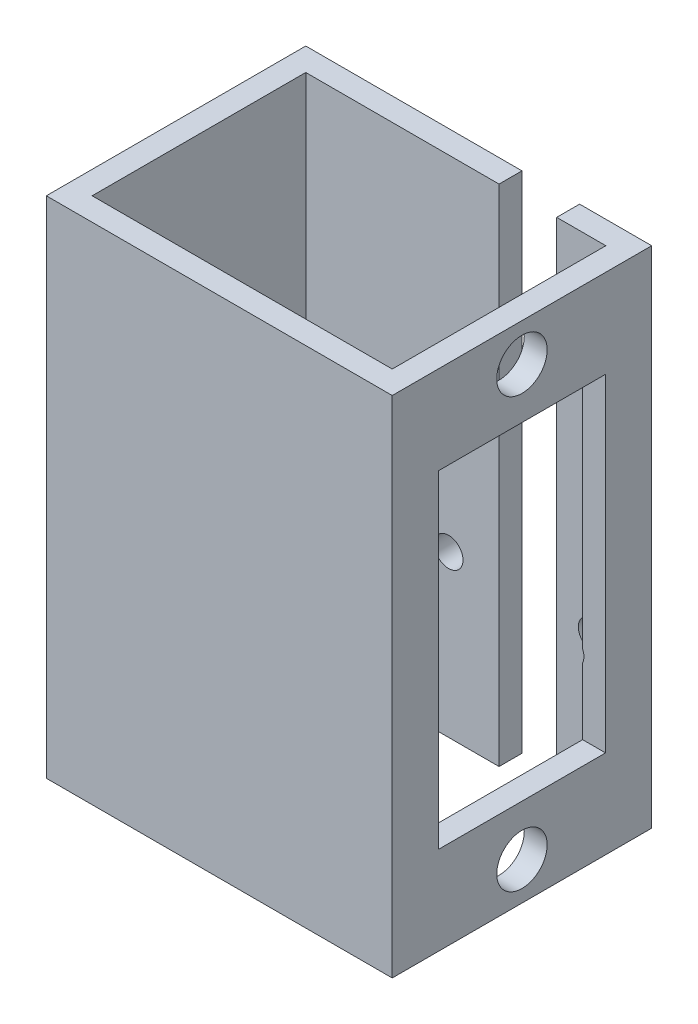
ISO-10303-21;
HEADER;
FILE_DESCRIPTION(('STEP AP214'),'2;1');
FILE_NAME('part.step','',(''),(''),'','','');
FILE_SCHEMA(('AUTOMOTIVE_DESIGN { 1 0 10303 214 1 1 1 1 }'));
ENDSEC;
DATA;
#1=APPLICATION_CONTEXT('core data for automotive mechanical design processes');
#2=APPLICATION_PROTOCOL_DEFINITION('international standard','automotive_design',2000,#1);
#3=PRODUCT_CONTEXT('',#1,'mechanical');
#4=PRODUCT('Part','Part','',(#3));
#5=PRODUCT_RELATED_PRODUCT_CATEGORY('part','',(#4));
#6=PRODUCT_DEFINITION_FORMATION('','',#4);
#7=PRODUCT_DEFINITION_CONTEXT('part definition',#1,'design');
#8=PRODUCT_DEFINITION('design','',#6,#7);
#9=PRODUCT_DEFINITION_SHAPE('','',#8);
#10=(LENGTH_UNIT() NAMED_UNIT(*) SI_UNIT(.MILLI.,.METRE.));
#11=(NAMED_UNIT(*) PLANE_ANGLE_UNIT() SI_UNIT($,.RADIAN.));
#12=(NAMED_UNIT(*) SI_UNIT($,.STERADIAN.) SOLID_ANGLE_UNIT());
#13=UNCERTAINTY_MEASURE_WITH_UNIT(LENGTH_MEASURE(1.E-05),#10,'distance_accuracy_value','');
#14=(GEOMETRIC_REPRESENTATION_CONTEXT(3) GLOBAL_UNCERTAINTY_ASSIGNED_CONTEXT((#13)) GLOBAL_UNIT_ASSIGNED_CONTEXT((#10,
#11,#12)) REPRESENTATION_CONTEXT('',''));
#15=CARTESIAN_POINT('',(0.,0.,0.));
#16=DIRECTION('',(0.,0.,1.));
#17=DIRECTION('',(1.,0.,0.));
#18=AXIS2_PLACEMENT_3D('',#15,#16,#17);
#19=CARTESIAN_POINT('',(0.,35.,0.));
#20=DIRECTION('',(1.,0.,0.));
#21=DIRECTION('',(0.,0.,-1.));
#22=AXIS2_PLACEMENT_3D('',#19,#20,#21);
#23=PLANE('',#22);
#24=CARTESIAN_POINT('',(0.,11.15,9.));
#25=DIRECTION('',(-1.,0.,0.));
#26=DIRECTION('',(0.,0.,1.));
#27=AXIS2_PLACEMENT_3D('',#24,#25,#26);
#28=CIRCLE('',#27,1.25);
#29=CARTESIAN_POINT('',(0.,11.15,10.25));
#30=VERTEX_POINT('',#29);
#31=EDGE_CURVE('E190',#30,#30,#28,.T.);
#32=ORIENTED_EDGE('',*,*,#31,.F.);
#33=EDGE_LOOP('',(#32));
#34=FACE_BOUND('',#33,.T.);
#35=DIRECTION('',(0.,0.,1.));
#36=VECTOR('',#35,1.);
#37=CARTESIAN_POINT('',(0.,0.,0.));
#38=LINE('',#37,#36);
#39=CARTESIAN_POINT('',(0.,0.,0.));
#40=VERTEX_POINT('',#39);
#41=CARTESIAN_POINT('',(0.,0.,18.));
#42=VERTEX_POINT('',#41);
#43=EDGE_CURVE('E219',#40,#42,#38,.T.);
#44=ORIENTED_EDGE('',*,*,#43,.T.);
#45=DIRECTION('',(0.,-1.,0.));
#46=VECTOR('',#45,1.);
#47=CARTESIAN_POINT('',(0.,35.,18.));
#48=LINE('',#47,#46);
#49=CARTESIAN_POINT('',(0.,35.,18.));
#50=VERTEX_POINT('',#49);
#51=EDGE_CURVE('E307',#50,#42,#48,.T.);
#52=ORIENTED_EDGE('',*,*,#51,.F.);
#53=DIRECTION('',(0.,0.,1.));
#54=VECTOR('',#53,1.);
#55=CARTESIAN_POINT('',(0.,35.,0.));
#56=LINE('',#55,#54);
#57=CARTESIAN_POINT('',(0.,35.,0.));
#58=VERTEX_POINT('',#57);
#59=EDGE_CURVE('E225',#58,#50,#56,.T.);
#60=ORIENTED_EDGE('',*,*,#59,.F.);
#61=DIRECTION('',(0.,-1.,0.));
#62=VECTOR('',#61,1.);
#63=CARTESIAN_POINT('',(0.,35.,0.));
#64=LINE('',#63,#62);
#65=EDGE_CURVE('E251',#58,#40,#64,.T.);
#66=ORIENTED_EDGE('',*,*,#65,.T.);
#67=EDGE_LOOP('',(#44,#52,#60,#66));
#68=FACE_BOUND('',#67,.T.);
#69=ADVANCED_FACE('F34',(#34,#68),#23,.F.);
#70=CARTESIAN_POINT('',(0.,35.,18.));
#71=DIRECTION('',(0.,0.,-1.));
#72=DIRECTION('',(-1.,0.,0.));
#73=AXIS2_PLACEMENT_3D('',#70,#71,#72);
#74=PLANE('',#73);
#75=DIRECTION('',(1.,0.,0.));
#76=VECTOR('',#75,1.);
#77=CARTESIAN_POINT('',(0.,0.,18.));
#78=LINE('',#77,#76);
#79=CARTESIAN_POINT('',(24.,0.,18.));
#80=VERTEX_POINT('',#79);
#81=EDGE_CURVE('E254',#42,#80,#78,.T.);
#82=ORIENTED_EDGE('',*,*,#81,.T.);
#83=DIRECTION('',(0.,-1.,0.));
#84=VECTOR('',#83,1.);
#85=CARTESIAN_POINT('',(24.,35.,18.));
#86=LINE('',#85,#84);
#87=CARTESIAN_POINT('',(24.,35.,18.));
#88=VERTEX_POINT('',#87);
#89=EDGE_CURVE('E304',#88,#80,#86,.T.);
#90=ORIENTED_EDGE('',*,*,#89,.F.);
#91=DIRECTION('',(1.,0.,0.));
#92=VECTOR('',#91,1.);
#93=CARTESIAN_POINT('',(0.,35.,18.));
#94=LINE('',#93,#92);
#95=EDGE_CURVE('E228',#50,#88,#94,.T.);
#96=ORIENTED_EDGE('',*,*,#95,.F.);
#97=ORIENTED_EDGE('',*,*,#51,.T.);
#98=EDGE_LOOP('',(#82,#90,#96,#97));
#99=FACE_BOUND('',#98,.T.);
#100=ADVANCED_FACE('F360',(#99),#74,.F.);
#101=CARTESIAN_POINT('',(24.,35.,0.));
#102=DIRECTION('',(-1.,0.,0.));
#103=DIRECTION('',(0.,0.,1.));
#104=AXIS2_PLACEMENT_3D('',#101,#102,#103);
#105=PLANE('',#104);
#106=CARTESIAN_POINT('',(24.,32.375,9.));
#107=DIRECTION('',(1.,0.,0.));
#108=DIRECTION('',(0.,0.,-1.));
#109=AXIS2_PLACEMENT_3D('',#106,#107,#108);
#110=CIRCLE('',#109,1.75);
#111=CARTESIAN_POINT('',(24.,32.375,7.25));
#112=VERTEX_POINT('',#111);
#113=EDGE_CURVE('E185',#112,#112,#110,.T.);
#114=ORIENTED_EDGE('',*,*,#113,.F.);
#115=EDGE_LOOP('',(#114));
#116=FACE_BOUND('',#115,.T.);
#117=CARTESIAN_POINT('',(24.,2.625,9.));
#118=DIRECTION('',(1.,0.,0.));
#119=DIRECTION('',(0.,0.,-1.));
#120=AXIS2_PLACEMENT_3D('',#117,#118,#119);
#121=CIRCLE('',#120,1.75);
#122=CARTESIAN_POINT('',(24.,2.625,7.25));
#123=VERTEX_POINT('',#122);
#124=EDGE_CURVE('E189',#123,#123,#121,.T.);
#125=ORIENTED_EDGE('',*,*,#124,.F.);
#126=EDGE_LOOP('',(#125));
#127=FACE_BOUND('',#126,.T.);
#128=DIRECTION('',(0.,0.,1.));
#129=VECTOR('',#128,1.);
#130=CARTESIAN_POINT('',(24.,28.875,14.8));
#131=LINE('',#130,#129);
#132=CARTESIAN_POINT('',(24.,28.875,3.2));
#133=VERTEX_POINT('',#132);
#134=CARTESIAN_POINT('',(24.,28.875,14.8));
#135=VERTEX_POINT('',#134);
#136=EDGE_CURVE('E208',#133,#135,#131,.T.);
#137=ORIENTED_EDGE('',*,*,#136,.F.);
#138=DIRECTION('',(0.,1.,0.));
#139=VECTOR('',#138,1.);
#140=CARTESIAN_POINT('',(24.,28.875,3.2));
#141=LINE('',#140,#139);
#142=CARTESIAN_POINT('',(24.,6.125,3.2));
#143=VERTEX_POINT('',#142);
#144=EDGE_CURVE('E55',#143,#133,#141,.T.);
#145=ORIENTED_EDGE('',*,*,#144,.F.);
#146=DIRECTION('',(0.,0.,-1.));
#147=VECTOR('',#146,1.);
#148=CARTESIAN_POINT('',(24.,6.125,14.8));
#149=LINE('',#148,#147);
#150=CARTESIAN_POINT('',(24.,6.125,14.8));
#151=VERTEX_POINT('',#150);
#152=EDGE_CURVE('E214',#151,#143,#149,.T.);
#153=ORIENTED_EDGE('',*,*,#152,.F.);
#154=DIRECTION('',(0.,-1.,0.));
#155=VECTOR('',#154,1.);
#156=CARTESIAN_POINT('',(24.,28.875,14.8));
#157=LINE('',#156,#155);
#158=EDGE_CURVE('E211',#135,#151,#157,.T.);
#159=ORIENTED_EDGE('',*,*,#158,.F.);
#160=EDGE_LOOP('',(#137,#145,#153,#159));
#161=FACE_BOUND('',#160,.T.);
#162=DIRECTION('',(0.,0.,-1.));
#163=VECTOR('',#162,1.);
#164=CARTESIAN_POINT('',(24.,0.,0.));
#165=LINE('',#164,#163);
#166=CARTESIAN_POINT('',(24.,0.,0.));
#167=VERTEX_POINT('',#166);
#168=EDGE_CURVE('E256',#80,#167,#165,.T.);
#169=ORIENTED_EDGE('',*,*,#168,.T.);
#170=DIRECTION('',(0.,-1.,0.));
#171=VECTOR('',#170,1.);
#172=CARTESIAN_POINT('',(24.,35.,0.));
#173=LINE('',#172,#171);
#174=CARTESIAN_POINT('',(24.,35.,0.));
#175=VERTEX_POINT('',#174);
#176=EDGE_CURVE('E301',#175,#167,#173,.T.);
#177=ORIENTED_EDGE('',*,*,#176,.F.);
#178=DIRECTION('',(0.,0.,-1.));
#179=VECTOR('',#178,1.);
#180=CARTESIAN_POINT('',(24.,35.,0.));
#181=LINE('',#180,#179);
#182=EDGE_CURVE('E231',#88,#175,#181,.T.);
#183=ORIENTED_EDGE('',*,*,#182,.F.);
#184=ORIENTED_EDGE('',*,*,#89,.T.);
#185=EDGE_LOOP('',(#169,#177,#183,#184));
#186=FACE_BOUND('',#185,.T.);
#187=ADVANCED_FACE('F357',(#116,#127,#161,#186),#105,.F.);
#188=CARTESIAN_POINT('',(19.,35.,0.));
#189=DIRECTION('',(0.,0.,1.));
#190=DIRECTION('',(1.,0.,0.));
#191=AXIS2_PLACEMENT_3D('',#188,#189,#190);
#192=PLANE('',#191);
#193=CARTESIAN_POINT('',(21.5,11.15,0.));
#194=DIRECTION('',(0.,0.,-1.));
#195=DIRECTION('',(-1.,0.,0.));
#196=AXIS2_PLACEMENT_3D('',#193,#194,#195);
#197=CIRCLE('',#196,1.);
#198=CARTESIAN_POINT('',(20.5,11.15,0.));
#199=VERTEX_POINT('',#198);
#200=EDGE_CURVE('E170',#199,#199,#197,.T.);
#201=ORIENTED_EDGE('',*,*,#200,.F.);
#202=EDGE_LOOP('',(#201));
#203=FACE_BOUND('',#202,.T.);
#204=DIRECTION('',(-1.,0.,0.));
#205=VECTOR('',#204,1.);
#206=CARTESIAN_POINT('',(19.,0.,0.));
#207=LINE('',#206,#205);
#208=CARTESIAN_POINT('',(19.,0.,0.));
#209=VERTEX_POINT('',#208);
#210=EDGE_CURVE('E258',#167,#209,#207,.T.);
#211=ORIENTED_EDGE('',*,*,#210,.T.);
#212=DIRECTION('',(0.,-1.,0.));
#213=VECTOR('',#212,1.);
#214=CARTESIAN_POINT('',(19.,35.,0.));
#215=LINE('',#214,#213);
#216=CARTESIAN_POINT('',(19.,35.,0.));
#217=VERTEX_POINT('',#216);
#218=EDGE_CURVE('E298',#217,#209,#215,.T.);
#219=ORIENTED_EDGE('',*,*,#218,.F.);
#220=DIRECTION('',(-1.,0.,0.));
#221=VECTOR('',#220,1.);
#222=CARTESIAN_POINT('',(19.,35.,0.));
#223=LINE('',#222,#221);
#224=EDGE_CURVE('E233',#175,#217,#223,.T.);
#225=ORIENTED_EDGE('',*,*,#224,.F.);
#226=ORIENTED_EDGE('',*,*,#176,.T.);
#227=EDGE_LOOP('',(#211,#219,#225,#226));
#228=FACE_BOUND('',#227,.T.);
#229=ADVANCED_FACE('F353',(#203,#228),#192,.F.);
#230=CARTESIAN_POINT('',(19.,35.,0.));
#231=DIRECTION('',(1.,0.,0.));
#232=DIRECTION('',(0.,0.,-1.));
#233=AXIS2_PLACEMENT_3D('',#230,#231,#232);
#234=PLANE('',#233);
#235=DIRECTION('',(0.,0.,1.));
#236=VECTOR('',#235,1.);
#237=CARTESIAN_POINT('',(19.,0.,0.));
#238=LINE('',#237,#236);
#239=CARTESIAN_POINT('',(19.,0.,1.59));
#240=VERTEX_POINT('',#239);
#241=EDGE_CURVE('E260',#209,#240,#238,.T.);
#242=ORIENTED_EDGE('',*,*,#241,.T.);
#243=DIRECTION('',(0.,-1.,0.));
#244=VECTOR('',#243,1.);
#245=CARTESIAN_POINT('',(19.,35.,1.59));
#246=LINE('',#245,#244);
#247=CARTESIAN_POINT('',(19.,35.,1.59));
#248=VERTEX_POINT('',#247);
#249=EDGE_CURVE('E295',#248,#240,#246,.T.);
#250=ORIENTED_EDGE('',*,*,#249,.F.);
#251=DIRECTION('',(0.,0.,1.));
#252=VECTOR('',#251,1.);
#253=CARTESIAN_POINT('',(19.,35.,0.));
#254=LINE('',#253,#252);
#255=EDGE_CURVE('E235',#217,#248,#254,.T.);
#256=ORIENTED_EDGE('',*,*,#255,.F.);
#257=ORIENTED_EDGE('',*,*,#218,.T.);
#258=EDGE_LOOP('',(#242,#250,#256,#257));
#259=FACE_BOUND('',#258,.T.);
#260=ADVANCED_FACE('F349',(#259),#234,.F.);
#261=CARTESIAN_POINT('',(19.,35.,1.59));
#262=DIRECTION('',(0.,0.,-1.));
#263=DIRECTION('',(-1.,0.,0.));
#264=AXIS2_PLACEMENT_3D('',#261,#262,#263);
#265=PLANE('',#264);
#266=DIRECTION('',(0.,-1.,0.));
#267=VECTOR('',#266,1.);
#268=CARTESIAN_POINT('',(22.41,35.,1.59));
#269=LINE('',#268,#267);
#270=CARTESIAN_POINT('',(22.41,10.7353917511674,1.59));
#271=VERTEX_POINT('',#270);
#272=CARTESIAN_POINT('',(22.41,0.,1.59));
#273=VERTEX_POINT('',#272);
#274=EDGE_CURVE('E293',#271,#273,#269,.T.);
#275=ORIENTED_EDGE('',*,*,#274,.F.);
#276=CARTESIAN_POINT('',(21.5,11.15,1.59));
#277=DIRECTION('',(0.,0.,-1.));
#278=DIRECTION('',(-1.,0.,0.));
#279=AXIS2_PLACEMENT_3D('',#276,#277,#278);
#280=CIRCLE('',#279,1.);
#281=CARTESIAN_POINT('',(22.41,11.5646082488326,1.59));
#282=VERTEX_POINT('',#281);
#283=EDGE_CURVE('E322',#271,#282,#280,.T.);
#284=ORIENTED_EDGE('',*,*,#283,.T.);
#285=CARTESIAN_POINT('',(22.41,35.,1.59));
#286=VERTEX_POINT('',#285);
#287=EDGE_CURVE('E169',#286,#282,#269,.T.);
#288=ORIENTED_EDGE('',*,*,#287,.F.);
#289=DIRECTION('',(1.,0.,0.));
#290=VECTOR('',#289,1.);
#291=CARTESIAN_POINT('',(19.,35.,1.59));
#292=LINE('',#291,#290);
#293=EDGE_CURVE('E237',#248,#286,#292,.T.);
#294=ORIENTED_EDGE('',*,*,#293,.F.);
#295=ORIENTED_EDGE('',*,*,#249,.T.);
#296=DIRECTION('',(1.,0.,0.));
#297=VECTOR('',#296,1.);
#298=CARTESIAN_POINT('',(19.,0.,1.59));
#299=LINE('',#298,#297);
#300=EDGE_CURVE('E262',#240,#273,#299,.T.);
#301=ORIENTED_EDGE('',*,*,#300,.T.);
#302=EDGE_LOOP('',(#275,#284,#288,#294,#295,#301));
#303=FACE_BOUND('',#302,.T.);
#304=ADVANCED_FACE('F325',(#303),#265,.F.);
#305=CARTESIAN_POINT('',(22.41,35.,1.59));
#306=DIRECTION('',(1.,0.,0.));
#307=DIRECTION('',(0.,0.,-1.));
#308=AXIS2_PLACEMENT_3D('',#305,#306,#307);
#309=PLANE('',#308);
#310=CARTESIAN_POINT('',(22.41,32.375,9.));
#311=DIRECTION('',(1.,0.,0.));
#312=DIRECTION('',(0.,0.,-1.));
#313=AXIS2_PLACEMENT_3D('',#310,#311,#312);
#314=CIRCLE('',#313,1.75);
#315=CARTESIAN_POINT('',(22.41,32.375,7.25));
#316=VERTEX_POINT('',#315);
#317=EDGE_CURVE('E184',#316,#316,#314,.T.);
#318=ORIENTED_EDGE('',*,*,#317,.T.);
#319=EDGE_LOOP('',(#318));
#320=FACE_BOUND('',#319,.T.);
#321=CARTESIAN_POINT('',(22.41,2.625,9.));
#322=DIRECTION('',(1.,0.,0.));
#323=DIRECTION('',(0.,0.,-1.));
#324=AXIS2_PLACEMENT_3D('',#321,#322,#323);
#325=CIRCLE('',#324,1.75);
#326=CARTESIAN_POINT('',(22.41,2.625,7.25));
#327=VERTEX_POINT('',#326);
#328=EDGE_CURVE('E181',#327,#327,#325,.T.);
#329=ORIENTED_EDGE('',*,*,#328,.T.);
#330=EDGE_LOOP('',(#329));
#331=FACE_BOUND('',#330,.T.);
#332=DIRECTION('',(0.,1.,0.));
#333=VECTOR('',#332,1.);
#334=CARTESIAN_POINT('',(22.41,35.,3.20000000000001));
#335=LINE('',#334,#333);
#336=CARTESIAN_POINT('',(22.41,6.125,3.2));
#337=VERTEX_POINT('',#336);
#338=CARTESIAN_POINT('',(22.41,10.7353917511674,3.2));
#339=VERTEX_POINT('',#338);
#340=EDGE_CURVE('E41',#337,#339,#335,.T.);
#341=ORIENTED_EDGE('',*,*,#340,.T.);
#342=DIRECTION('',(0.,0.,-1.));
#343=VECTOR('',#342,1.);
#344=CARTESIAN_POINT('',(22.41,10.7353917511674,4.));
#345=LINE('',#344,#343);
#346=EDGE_CURVE('E48',#339,#271,#345,.T.);
#347=ORIENTED_EDGE('',*,*,#346,.T.);
#348=ORIENTED_EDGE('',*,*,#274,.T.);
#349=DIRECTION('',(0.,0.,1.));
#350=VECTOR('',#349,1.);
#351=CARTESIAN_POINT('',(22.41,0.,1.59));
#352=LINE('',#351,#350);
#353=CARTESIAN_POINT('',(22.41,0.,16.41));
#354=VERTEX_POINT('',#353);
#355=EDGE_CURVE('E265',#273,#354,#352,.T.);
#356=ORIENTED_EDGE('',*,*,#355,.T.);
#357=DIRECTION('',(0.,-1.,0.));
#358=VECTOR('',#357,1.);
#359=CARTESIAN_POINT('',(22.41,35.,16.41));
#360=LINE('',#359,#358);
#361=CARTESIAN_POINT('',(22.41,35.,16.41));
#362=VERTEX_POINT('',#361);
#363=EDGE_CURVE('E290',#362,#354,#360,.T.);
#364=ORIENTED_EDGE('',*,*,#363,.F.);
#365=DIRECTION('',(0.,0.,1.));
#366=VECTOR('',#365,1.);
#367=CARTESIAN_POINT('',(22.41,35.,1.59));
#368=LINE('',#367,#366);
#369=EDGE_CURVE('E239',#286,#362,#368,.T.);
#370=ORIENTED_EDGE('',*,*,#369,.F.);
#371=ORIENTED_EDGE('',*,*,#287,.T.);
#372=DIRECTION('',(0.,0.,-1.));
#373=VECTOR('',#372,1.);
#374=CARTESIAN_POINT('',(22.41,11.5646082488326,4.));
#375=LINE('',#374,#373);
#376=CARTESIAN_POINT('',(22.41,11.5646082488326,3.2));
#377=VERTEX_POINT('',#376);
#378=EDGE_CURVE('E157',#282,#377,#375,.F.);
#379=ORIENTED_EDGE('',*,*,#378,.T.);
#380=CARTESIAN_POINT('',(22.41,28.875,3.2));
#381=VERTEX_POINT('',#380);
#382=EDGE_CURVE('E165',#377,#381,#335,.T.);
#383=ORIENTED_EDGE('',*,*,#382,.T.);
#384=DIRECTION('',(0.,0.,1.));
#385=VECTOR('',#384,1.);
#386=CARTESIAN_POINT('',(22.41,28.875,1.59));
#387=LINE('',#386,#385);
#388=CARTESIAN_POINT('',(22.41,28.875,14.8));
#389=VERTEX_POINT('',#388);
#390=EDGE_CURVE('E310',#381,#389,#387,.T.);
#391=ORIENTED_EDGE('',*,*,#390,.T.);
#392=DIRECTION('',(0.,-1.,0.));
#393=VECTOR('',#392,1.);
#394=CARTESIAN_POINT('',(22.41,35.,14.8));
#395=LINE('',#394,#393);
#396=CARTESIAN_POINT('',(22.41,6.125,14.8));
#397=VERTEX_POINT('',#396);
#398=EDGE_CURVE('E177',#389,#397,#395,.T.);
#399=ORIENTED_EDGE('',*,*,#398,.T.);
#400=DIRECTION('',(0.,0.,-1.));
#401=VECTOR('',#400,1.);
#402=CARTESIAN_POINT('',(22.41,6.125,1.59));
#403=LINE('',#402,#401);
#404=EDGE_CURVE('E174',#397,#337,#403,.T.);
#405=ORIENTED_EDGE('',*,*,#404,.T.);
#406=EDGE_LOOP('',(#341,#347,#348,#356,#364,#370,#371,#379,#383,#391,#399,#405));
#407=FACE_BOUND('',#406,.T.);
#408=ADVANCED_FACE('F163',(#320,#331,#407),#309,.F.);
#409=CARTESIAN_POINT('',(1.59,35.,16.41));
#410=DIRECTION('',(0.,0.,1.));
#411=DIRECTION('',(1.,0.,0.));
#412=AXIS2_PLACEMENT_3D('',#409,#410,#411);
#413=PLANE('',#412);
#414=DIRECTION('',(-1.,0.,0.));
#415=VECTOR('',#414,1.);
#416=CARTESIAN_POINT('',(1.59,0.,16.41));
#417=LINE('',#416,#415);
#418=CARTESIAN_POINT('',(1.59,0.,16.41));
#419=VERTEX_POINT('',#418);
#420=EDGE_CURVE('E267',#354,#419,#417,.T.);
#421=ORIENTED_EDGE('',*,*,#420,.T.);
#422=DIRECTION('',(0.,-1.,0.));
#423=VECTOR('',#422,1.);
#424=CARTESIAN_POINT('',(1.59,35.,16.41));
#425=LINE('',#424,#423);
#426=CARTESIAN_POINT('',(1.59,35.,16.41));
#427=VERTEX_POINT('',#426);
#428=EDGE_CURVE('E287',#427,#419,#425,.T.);
#429=ORIENTED_EDGE('',*,*,#428,.F.);
#430=DIRECTION('',(-1.,0.,0.));
#431=VECTOR('',#430,1.);
#432=CARTESIAN_POINT('',(1.59,35.,16.41));
#433=LINE('',#432,#431);
#434=EDGE_CURVE('E241',#362,#427,#433,.T.);
#435=ORIENTED_EDGE('',*,*,#434,.F.);
#436=ORIENTED_EDGE('',*,*,#363,.T.);
#437=EDGE_LOOP('',(#421,#429,#435,#436));
#438=FACE_BOUND('',#437,.T.);
#439=ADVANCED_FACE('F339',(#438),#413,.F.);
#440=CARTESIAN_POINT('',(1.59,35.,1.59));
#441=DIRECTION('',(-1.,0.,0.));
#442=DIRECTION('',(0.,0.,1.));
#443=AXIS2_PLACEMENT_3D('',#440,#441,#442);
#444=PLANE('',#443);
#445=CARTESIAN_POINT('',(1.59,11.15,9.));
#446=DIRECTION('',(-1.,0.,0.));
#447=DIRECTION('',(0.,0.,1.));
#448=AXIS2_PLACEMENT_3D('',#445,#446,#447);
#449=CIRCLE('',#448,1.25);
#450=CARTESIAN_POINT('',(1.59,11.15,10.25));
#451=VERTEX_POINT('',#450);
#452=EDGE_CURVE('E187',#451,#451,#449,.T.);
#453=ORIENTED_EDGE('',*,*,#452,.T.);
#454=EDGE_LOOP('',(#453));
#455=FACE_BOUND('',#454,.T.);
#456=DIRECTION('',(0.,0.,-1.));
#457=VECTOR('',#456,1.);
#458=CARTESIAN_POINT('',(1.59,0.,1.59));
#459=LINE('',#458,#457);
#460=CARTESIAN_POINT('',(1.59,0.,1.59));
#461=VERTEX_POINT('',#460);
#462=EDGE_CURVE('E269',#419,#461,#459,.T.);
#463=ORIENTED_EDGE('',*,*,#462,.T.);
#464=DIRECTION('',(0.,-1.,0.));
#465=VECTOR('',#464,1.);
#466=CARTESIAN_POINT('',(1.59,35.,1.59));
#467=LINE('',#466,#465);
#468=CARTESIAN_POINT('',(1.59,35.,1.59));
#469=VERTEX_POINT('',#468);
#470=EDGE_CURVE('E284',#469,#461,#467,.T.);
#471=ORIENTED_EDGE('',*,*,#470,.F.);
#472=DIRECTION('',(0.,0.,-1.));
#473=VECTOR('',#472,1.);
#474=CARTESIAN_POINT('',(1.59,35.,1.59));
#475=LINE('',#474,#473);
#476=EDGE_CURVE('E243',#427,#469,#475,.T.);
#477=ORIENTED_EDGE('',*,*,#476,.F.);
#478=ORIENTED_EDGE('',*,*,#428,.T.);
#479=EDGE_LOOP('',(#463,#471,#477,#478));
#480=FACE_BOUND('',#479,.T.);
#481=ADVANCED_FACE('F380',(#455,#480),#444,.F.);
#482=CARTESIAN_POINT('',(1.59,35.,1.59));
#483=DIRECTION('',(0.,0.,-1.));
#484=DIRECTION('',(-1.,0.,0.));
#485=AXIS2_PLACEMENT_3D('',#482,#483,#484);
#486=PLANE('',#485);
#487=CARTESIAN_POINT('',(11.5,11.15,1.58999999999999));
#488=DIRECTION('',(0.,0.,-1.));
#489=DIRECTION('',(-1.,0.,0.));
#490=AXIS2_PLACEMENT_3D('',#487,#488,#489);
#491=CIRCLE('',#490,1.);
#492=CARTESIAN_POINT('',(10.5,11.15,1.58999999999999));
#493=VERTEX_POINT('',#492);
#494=EDGE_CURVE('E196',#493,#493,#491,.T.);
#495=ORIENTED_EDGE('',*,*,#494,.T.);
#496=EDGE_LOOP('',(#495));
#497=FACE_BOUND('',#496,.T.);
#498=DIRECTION('',(1.,0.,0.));
#499=VECTOR('',#498,1.);
#500=CARTESIAN_POINT('',(1.59,0.,1.59));
#501=LINE('',#500,#499);
#502=CARTESIAN_POINT('',(15.,0.,1.58999999999999));
#503=VERTEX_POINT('',#502);
#504=EDGE_CURVE('E271',#461,#503,#501,.T.);
#505=ORIENTED_EDGE('',*,*,#504,.T.);
#506=DIRECTION('',(0.,-1.,0.));
#507=VECTOR('',#506,1.);
#508=CARTESIAN_POINT('',(15.,35.,1.58999999999999));
#509=LINE('',#508,#507);
#510=CARTESIAN_POINT('',(15.,35.,1.58999999999999));
#511=VERTEX_POINT('',#510);
#512=EDGE_CURVE('E281',#511,#503,#509,.T.);
#513=ORIENTED_EDGE('',*,*,#512,.F.);
#514=DIRECTION('',(1.,0.,0.));
#515=VECTOR('',#514,1.);
#516=CARTESIAN_POINT('',(1.59,35.,1.59));
#517=LINE('',#516,#515);
#518=EDGE_CURVE('E245',#469,#511,#517,.T.);
#519=ORIENTED_EDGE('',*,*,#518,.F.);
#520=ORIENTED_EDGE('',*,*,#470,.T.);
#521=EDGE_LOOP('',(#505,#513,#519,#520));
#522=FACE_BOUND('',#521,.T.);
#523=ADVANCED_FACE('F377',(#497,#522),#486,.F.);
#524=CARTESIAN_POINT('',(15.,35.,0.));
#525=DIRECTION('',(-1.,0.,0.));
#526=DIRECTION('',(0.,0.,1.));
#527=AXIS2_PLACEMENT_3D('',#524,#525,#526);
#528=PLANE('',#527);
#529=DIRECTION('',(0.,0.,-1.));
#530=VECTOR('',#529,1.);
#531=CARTESIAN_POINT('',(15.,0.,0.));
#532=LINE('',#531,#530);
#533=CARTESIAN_POINT('',(15.,0.,0.));
#534=VERTEX_POINT('',#533);
#535=EDGE_CURVE('E273',#503,#534,#532,.T.);
#536=ORIENTED_EDGE('',*,*,#535,.T.);
#537=DIRECTION('',(0.,-1.,0.));
#538=VECTOR('',#537,1.);
#539=CARTESIAN_POINT('',(15.,35.,0.));
#540=LINE('',#539,#538);
#541=CARTESIAN_POINT('',(15.,35.,0.));
#542=VERTEX_POINT('',#541);
#543=EDGE_CURVE('E278',#542,#534,#540,.T.);
#544=ORIENTED_EDGE('',*,*,#543,.F.);
#545=DIRECTION('',(0.,0.,-1.));
#546=VECTOR('',#545,1.);
#547=CARTESIAN_POINT('',(15.,35.,0.));
#548=LINE('',#547,#546);
#549=EDGE_CURVE('E247',#511,#542,#548,.T.);
#550=ORIENTED_EDGE('',*,*,#549,.F.);
#551=ORIENTED_EDGE('',*,*,#512,.T.);
#552=EDGE_LOOP('',(#536,#544,#550,#551));
#553=FACE_BOUND('',#552,.T.);
#554=ADVANCED_FACE('F373',(#553),#528,.F.);
#555=CARTESIAN_POINT('',(0.,35.,0.));
#556=DIRECTION('',(0.,0.,1.));
#557=DIRECTION('',(1.,0.,0.));
#558=AXIS2_PLACEMENT_3D('',#555,#556,#557);
#559=PLANE('',#558);
#560=CARTESIAN_POINT('',(11.5,11.15,0.));
#561=DIRECTION('',(0.,0.,-1.));
#562=DIRECTION('',(-1.,0.,0.));
#563=AXIS2_PLACEMENT_3D('',#560,#561,#562);
#564=CIRCLE('',#563,1.);
#565=CARTESIAN_POINT('',(10.5,11.15,0.));
#566=VERTEX_POINT('',#565);
#567=EDGE_CURVE('E201',#566,#566,#564,.T.);
#568=ORIENTED_EDGE('',*,*,#567,.F.);
#569=EDGE_LOOP('',(#568));
#570=FACE_BOUND('',#569,.T.);
#571=DIRECTION('',(-1.,0.,0.));
#572=VECTOR('',#571,1.);
#573=CARTESIAN_POINT('',(0.,0.,0.));
#574=LINE('',#573,#572);
#575=EDGE_CURVE('E229',#534,#40,#574,.T.);
#576=ORIENTED_EDGE('',*,*,#575,.T.);
#577=ORIENTED_EDGE('',*,*,#65,.F.);
#578=DIRECTION('',(-1.,0.,0.));
#579=VECTOR('',#578,1.);
#580=CARTESIAN_POINT('',(0.,35.,0.));
#581=LINE('',#580,#579);
#582=EDGE_CURVE('E249',#542,#58,#581,.T.);
#583=ORIENTED_EDGE('',*,*,#582,.F.);
#584=ORIENTED_EDGE('',*,*,#543,.T.);
#585=EDGE_LOOP('',(#576,#577,#583,#584));
#586=FACE_BOUND('',#585,.T.);
#587=ADVANCED_FACE('F369',(#570,#586),#559,.F.);
#588=CARTESIAN_POINT('',(0.,35.,0.));
#589=DIRECTION('',(0.,1.,0.));
#590=DIRECTION('',(0.,0.,1.));
#591=AXIS2_PLACEMENT_3D('',#588,#589,#590);
#592=PLANE('',#591);
#593=ORIENTED_EDGE('',*,*,#59,.T.);
#594=ORIENTED_EDGE('',*,*,#95,.T.);
#595=ORIENTED_EDGE('',*,*,#182,.T.);
#596=ORIENTED_EDGE('',*,*,#224,.T.);
#597=ORIENTED_EDGE('',*,*,#255,.T.);
#598=ORIENTED_EDGE('',*,*,#293,.T.);
#599=ORIENTED_EDGE('',*,*,#369,.T.);
#600=ORIENTED_EDGE('',*,*,#434,.T.);
#601=ORIENTED_EDGE('',*,*,#476,.T.);
#602=ORIENTED_EDGE('',*,*,#518,.T.);
#603=ORIENTED_EDGE('',*,*,#549,.T.);
#604=ORIENTED_EDGE('',*,*,#582,.T.);
#605=EDGE_LOOP('',(#593,#594,#595,#596,#597,#598,#599,#600,#601,#602,#603,#604));
#606=FACE_BOUND('',#605,.T.);
#607=ADVANCED_FACE('F343',(#606),#592,.T.);
#608=CARTESIAN_POINT('',(0.,0.,0.));
#609=DIRECTION('',(0.,1.,0.));
#610=DIRECTION('',(0.,0.,1.));
#611=AXIS2_PLACEMENT_3D('',#608,#609,#610);
#612=PLANE('',#611);
#613=ORIENTED_EDGE('',*,*,#43,.F.);
#614=ORIENTED_EDGE('',*,*,#575,.F.);
#615=ORIENTED_EDGE('',*,*,#535,.F.);
#616=ORIENTED_EDGE('',*,*,#504,.F.);
#617=ORIENTED_EDGE('',*,*,#462,.F.);
#618=ORIENTED_EDGE('',*,*,#420,.F.);
#619=ORIENTED_EDGE('',*,*,#355,.F.);
#620=ORIENTED_EDGE('',*,*,#300,.F.);
#621=ORIENTED_EDGE('',*,*,#241,.F.);
#622=ORIENTED_EDGE('',*,*,#210,.F.);
#623=ORIENTED_EDGE('',*,*,#168,.F.);
#624=ORIENTED_EDGE('',*,*,#81,.F.);
#625=EDGE_LOOP('',(#613,#614,#615,#616,#617,#618,#619,#620,#621,#622,#623,#624));
#626=FACE_BOUND('',#625,.T.);
#627=ADVANCED_FACE('F334',(#626),#612,.F.);
#628=CARTESIAN_POINT('',(20.,28.875,3.2));
#629=DIRECTION('',(0.,0.,-1.));
#630=DIRECTION('',(-1.,0.,0.));
#631=AXIS2_PLACEMENT_3D('',#628,#629,#630);
#632=PLANE('',#631);
#633=ORIENTED_EDGE('',*,*,#382,.F.);
#634=CARTESIAN_POINT('',(21.5,11.15,3.2));
#635=DIRECTION('',(0.,0.,-1.));
#636=DIRECTION('',(-1.,0.,0.));
#637=AXIS2_PLACEMENT_3D('',#634,#635,#636);
#638=CIRCLE('',#637,1.);
#639=EDGE_CURVE('E11',#377,#339,#638,.T.);
#640=ORIENTED_EDGE('',*,*,#639,.T.);
#641=ORIENTED_EDGE('',*,*,#340,.F.);
#642=DIRECTION('',(1.,0.,0.));
#643=VECTOR('',#642,1.);
#644=CARTESIAN_POINT('',(20.,6.125,3.2));
#645=LINE('',#644,#643);
#646=EDGE_CURVE('E217',#337,#143,#645,.T.);
#647=ORIENTED_EDGE('',*,*,#646,.T.);
#648=ORIENTED_EDGE('',*,*,#144,.T.);
#649=DIRECTION('',(1.,0.,0.));
#650=VECTOR('',#649,1.);
#651=CARTESIAN_POINT('',(20.,28.875,3.2));
#652=LINE('',#651,#650);
#653=EDGE_CURVE('E173',#381,#133,#652,.T.);
#654=ORIENTED_EDGE('',*,*,#653,.F.);
#655=EDGE_LOOP('',(#633,#640,#641,#647,#648,#654));
#656=FACE_BOUND('',#655,.T.);
#657=ADVANCED_FACE('F172',(#656),#632,.F.);
#658=CARTESIAN_POINT('',(20.,6.125,14.8));
#659=DIRECTION('',(0.,-1.,0.));
#660=DIRECTION('',(0.,0.,-1.));
#661=AXIS2_PLACEMENT_3D('',#658,#659,#660);
#662=PLANE('',#661);
#663=DIRECTION('',(1.,0.,0.));
#664=VECTOR('',#663,1.);
#665=CARTESIAN_POINT('',(20.,6.125,14.8));
#666=LINE('',#665,#664);
#667=EDGE_CURVE('E220',#397,#151,#666,.T.);
#668=ORIENTED_EDGE('',*,*,#667,.T.);
#669=ORIENTED_EDGE('',*,*,#152,.T.);
#670=ORIENTED_EDGE('',*,*,#646,.F.);
#671=ORIENTED_EDGE('',*,*,#404,.F.);
#672=EDGE_LOOP('',(#668,#669,#670,#671));
#673=FACE_BOUND('',#672,.T.);
#674=ADVANCED_FACE('F319',(#673),#662,.F.);
#675=CARTESIAN_POINT('',(20.,28.875,14.8));
#676=DIRECTION('',(0.,0.,1.));
#677=DIRECTION('',(1.,0.,0.));
#678=AXIS2_PLACEMENT_3D('',#675,#676,#677);
#679=PLANE('',#678);
#680=DIRECTION('',(1.,0.,0.));
#681=VECTOR('',#680,1.);
#682=CARTESIAN_POINT('',(20.,28.875,14.8));
#683=LINE('',#682,#681);
#684=EDGE_CURVE('E222',#389,#135,#683,.T.);
#685=ORIENTED_EDGE('',*,*,#684,.T.);
#686=ORIENTED_EDGE('',*,*,#158,.T.);
#687=ORIENTED_EDGE('',*,*,#667,.F.);
#688=ORIENTED_EDGE('',*,*,#398,.F.);
#689=EDGE_LOOP('',(#685,#686,#687,#688));
#690=FACE_BOUND('',#689,.T.);
#691=ADVANCED_FACE('F315',(#690),#679,.F.);
#692=CARTESIAN_POINT('',(20.,28.875,14.8));
#693=DIRECTION('',(0.,1.,0.));
#694=DIRECTION('',(0.,0.,1.));
#695=AXIS2_PLACEMENT_3D('',#692,#693,#694);
#696=PLANE('',#695);
#697=ORIENTED_EDGE('',*,*,#653,.T.);
#698=ORIENTED_EDGE('',*,*,#136,.T.);
#699=ORIENTED_EDGE('',*,*,#684,.F.);
#700=ORIENTED_EDGE('',*,*,#390,.F.);
#701=EDGE_LOOP('',(#697,#698,#699,#700));
#702=FACE_BOUND('',#701,.T.);
#703=ADVANCED_FACE('F419',(#702),#696,.F.);
#704=CARTESIAN_POINT('',(20.,2.625,9.));
#705=DIRECTION('',(1.,0.,0.));
#706=DIRECTION('',(0.,0.,-1.));
#707=AXIS2_PLACEMENT_3D('',#704,#705,#706);
#708=CYLINDRICAL_SURFACE('',#707,1.75);
#709=ORIENTED_EDGE('',*,*,#124,.T.);
#710=EDGE_LOOP('',(#709));
#711=FACE_BOUND('',#710,.T.);
#712=ORIENTED_EDGE('',*,*,#328,.F.);
#713=EDGE_LOOP('',(#712));
#714=FACE_BOUND('',#713,.T.);
#715=ADVANCED_FACE('F416',(#711,#714),#708,.F.);
#716=CARTESIAN_POINT('',(20.,32.375,9.));
#717=DIRECTION('',(1.,0.,0.));
#718=DIRECTION('',(0.,0.,-1.));
#719=AXIS2_PLACEMENT_3D('',#716,#717,#718);
#720=CYLINDRICAL_SURFACE('',#719,1.75);
#721=ORIENTED_EDGE('',*,*,#113,.T.);
#722=EDGE_LOOP('',(#721));
#723=FACE_BOUND('',#722,.T.);
#724=ORIENTED_EDGE('',*,*,#317,.F.);
#725=EDGE_LOOP('',(#724));
#726=FACE_BOUND('',#725,.T.);
#727=ADVANCED_FACE('F418',(#723,#726),#720,.F.);
#728=CARTESIAN_POINT('',(32.,11.15,9.));
#729=DIRECTION('',(-1.,0.,0.));
#730=DIRECTION('',(0.,0.,1.));
#731=AXIS2_PLACEMENT_3D('',#728,#729,#730);
#732=CYLINDRICAL_SURFACE('',#731,1.25);
#733=ORIENTED_EDGE('',*,*,#31,.T.);
#734=EDGE_LOOP('',(#733));
#735=FACE_BOUND('',#734,.T.);
#736=ORIENTED_EDGE('',*,*,#452,.F.);
#737=EDGE_LOOP('',(#736));
#738=FACE_BOUND('',#737,.T.);
#739=ADVANCED_FACE('F426',(#735,#738),#732,.F.);
#740=CARTESIAN_POINT('',(11.5,11.15,4.));
#741=DIRECTION('',(0.,0.,-1.));
#742=DIRECTION('',(-1.,0.,0.));
#743=AXIS2_PLACEMENT_3D('',#740,#741,#742);
#744=CYLINDRICAL_SURFACE('',#743,1.);
#745=ORIENTED_EDGE('',*,*,#567,.T.);
#746=EDGE_LOOP('',(#745));
#747=FACE_BOUND('',#746,.T.);
#748=ORIENTED_EDGE('',*,*,#494,.F.);
#749=EDGE_LOOP('',(#748));
#750=FACE_BOUND('',#749,.T.);
#751=ADVANCED_FACE('F512',(#747,#750),#744,.F.);
#752=CARTESIAN_POINT('',(21.5,11.15,4.));
#753=DIRECTION('',(0.,0.,-1.));
#754=DIRECTION('',(-1.,0.,0.));
#755=AXIS2_PLACEMENT_3D('',#752,#753,#754);
#756=CYLINDRICAL_SURFACE('',#755,1.);
#757=ORIENTED_EDGE('',*,*,#200,.T.);
#758=EDGE_LOOP('',(#757));
#759=FACE_BOUND('',#758,.T.);
#760=ORIENTED_EDGE('',*,*,#346,.F.);
#761=ORIENTED_EDGE('',*,*,#639,.F.);
#762=ORIENTED_EDGE('',*,*,#378,.F.);
#763=ORIENTED_EDGE('',*,*,#283,.F.);
#764=EDGE_LOOP('',(#760,#761,#762,#763));
#765=FACE_BOUND('',#764,.T.);
#766=ADVANCED_FACE('F156',(#759,#765),#756,.F.);
#767=CLOSED_SHELL('',(#69,#100,#187,#229,#260,#304,#408,#439,#481,#523,#554,#587,#607,#627,#657,
#674,#691,#703,#715,#727,#739,#751,#766));
#768=MANIFOLD_SOLID_BREP('B2',#767);
#769=ADVANCED_BREP_SHAPE_REPRESENTATION('',(#18,#768),#14);
#770=SHAPE_DEFINITION_REPRESENTATION(#9,#769);
ENDSEC;
END-ISO-10303-21;
